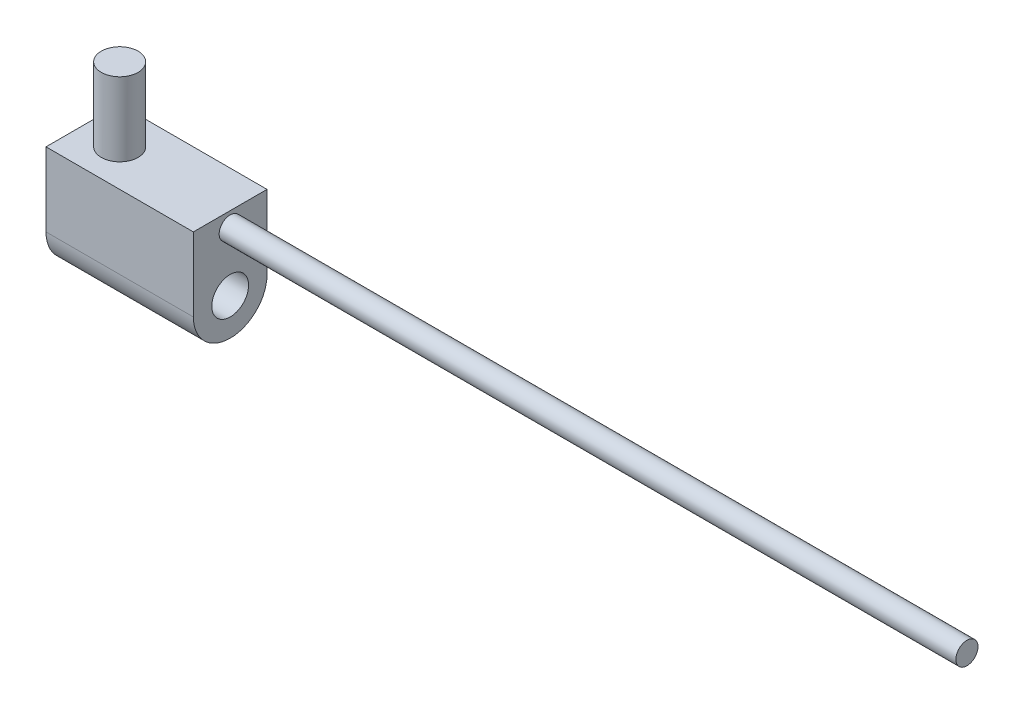
ISO-10303-21;
HEADER;
FILE_DESCRIPTION(('STEP AP214'),'2;1');
FILE_NAME('part.step','',(''),(''),'','','');
FILE_SCHEMA(('AUTOMOTIVE_DESIGN { 1 0 10303 214 1 1 1 1 }'));
ENDSEC;
DATA;
#1=APPLICATION_CONTEXT('core data for automotive mechanical design processes');
#2=APPLICATION_PROTOCOL_DEFINITION('international standard','automotive_design',2000,#1);
#3=PRODUCT_CONTEXT('',#1,'mechanical');
#4=PRODUCT('Part','Part','',(#3));
#5=PRODUCT_RELATED_PRODUCT_CATEGORY('part','',(#4));
#6=PRODUCT_DEFINITION_FORMATION('','',#4);
#7=PRODUCT_DEFINITION_CONTEXT('part definition',#1,'design');
#8=PRODUCT_DEFINITION('design','',#6,#7);
#9=PRODUCT_DEFINITION_SHAPE('','',#8);
#10=(LENGTH_UNIT() NAMED_UNIT(*) SI_UNIT(.MILLI.,.METRE.));
#11=(NAMED_UNIT(*) PLANE_ANGLE_UNIT() SI_UNIT($,.RADIAN.));
#12=(NAMED_UNIT(*) SI_UNIT($,.STERADIAN.) SOLID_ANGLE_UNIT());
#13=UNCERTAINTY_MEASURE_WITH_UNIT(LENGTH_MEASURE(1.E-05),#10,'distance_accuracy_value','');
#14=(GEOMETRIC_REPRESENTATION_CONTEXT(3) GLOBAL_UNCERTAINTY_ASSIGNED_CONTEXT((#13)) GLOBAL_UNIT_ASSIGNED_CONTEXT((#10,
#11,#12)) REPRESENTATION_CONTEXT('',''));
#15=CARTESIAN_POINT('',(0.,0.,0.));
#16=DIRECTION('',(0.,0.,1.));
#17=DIRECTION('',(1.,0.,0.));
#18=AXIS2_PLACEMENT_3D('',#15,#16,#17);
#19=CARTESIAN_POINT('',(0.,-2.5,0.));
#20=DIRECTION('',(-1.,0.,0.));
#21=DIRECTION('',(0.,0.,1.));
#22=AXIS2_PLACEMENT_3D('',#19,#20,#21);
#23=CYLINDRICAL_SURFACE('',#22,5.);
#24=DIRECTION('',(-1.,0.,0.));
#25=VECTOR('',#24,1.);
#26=CARTESIAN_POINT('',(20.,-2.5,5.));
#27=LINE('',#26,#25);
#28=CARTESIAN_POINT('',(0.,-2.5,5.));
#29=VERTEX_POINT('',#28);
#30=CARTESIAN_POINT('',(20.,-2.5,5.));
#31=VERTEX_POINT('',#30);
#32=EDGE_CURVE('E88',#29,#31,#27,.F.);
#33=ORIENTED_EDGE('',*,*,#32,.F.);
#34=CARTESIAN_POINT('',(0.,-2.5,0.));
#35=DIRECTION('',(1.,0.,0.));
#36=DIRECTION('',(0.,0.,-1.));
#37=AXIS2_PLACEMENT_3D('',#34,#35,#36);
#38=CIRCLE('',#37,5.);
#39=CARTESIAN_POINT('',(0.,-2.5,-5.));
#40=VERTEX_POINT('',#39);
#41=EDGE_CURVE('E55',#40,#29,#38,.F.);
#42=ORIENTED_EDGE('',*,*,#41,.F.);
#43=DIRECTION('',(-1.,0.,0.));
#44=VECTOR('',#43,1.);
#45=CARTESIAN_POINT('',(20.,-2.5,-5.));
#46=LINE('',#45,#44);
#47=CARTESIAN_POINT('',(20.,-2.5,-5.));
#48=VERTEX_POINT('',#47);
#49=EDGE_CURVE('E107',#48,#40,#46,.T.);
#50=ORIENTED_EDGE('',*,*,#49,.F.);
#51=CARTESIAN_POINT('',(20.,-2.5,0.));
#52=DIRECTION('',(1.,0.,0.));
#53=DIRECTION('',(0.,0.,-1.));
#54=AXIS2_PLACEMENT_3D('',#51,#52,#53);
#55=CIRCLE('',#54,5.);
#56=EDGE_CURVE('E42',#31,#48,#55,.T.);
#57=ORIENTED_EDGE('',*,*,#56,.F.);
#58=EDGE_LOOP('',(#33,#42,#50,#57));
#59=FACE_BOUND('',#58,.T.);
#60=ADVANCED_FACE('F34',(#59),#23,.T.);
#61=CARTESIAN_POINT('',(20.,-7.5,5.));
#62=DIRECTION('',(0.,0.,-1.));
#63=DIRECTION('',(-1.,0.,0.));
#64=AXIS2_PLACEMENT_3D('',#61,#62,#63);
#65=PLANE('',#64);
#66=DIRECTION('',(0.,-1.,0.));
#67=VECTOR('',#66,1.);
#68=CARTESIAN_POINT('',(0.,-7.5,5.));
#69=LINE('',#68,#67);
#70=CARTESIAN_POINT('',(0.,7.49999999999999,5.));
#71=VERTEX_POINT('',#70);
#72=EDGE_CURVE('E98',#71,#29,#69,.T.);
#73=ORIENTED_EDGE('',*,*,#72,.T.);
#74=ORIENTED_EDGE('',*,*,#32,.T.);
#75=DIRECTION('',(0.,-1.,0.));
#76=VECTOR('',#75,1.);
#77=CARTESIAN_POINT('',(20.,-7.5,5.));
#78=LINE('',#77,#76);
#79=CARTESIAN_POINT('',(20.,7.49999999999999,5.));
#80=VERTEX_POINT('',#79);
#81=EDGE_CURVE('E79',#80,#31,#78,.T.);
#82=ORIENTED_EDGE('',*,*,#81,.F.);
#83=DIRECTION('',(-1.,0.,0.));
#84=VECTOR('',#83,1.);
#85=CARTESIAN_POINT('',(20.,7.49999999999999,5.));
#86=LINE('',#85,#84);
#87=EDGE_CURVE('E89',#80,#71,#86,.T.);
#88=ORIENTED_EDGE('',*,*,#87,.T.);
#89=EDGE_LOOP('',(#73,#74,#82,#88));
#90=FACE_BOUND('',#89,.T.);
#91=ADVANCED_FACE('F113',(#90),#65,.F.);
#92=CARTESIAN_POINT('',(20.,-7.5,-5.));
#93=DIRECTION('',(0.,0.,1.));
#94=DIRECTION('',(1.,0.,0.));
#95=AXIS2_PLACEMENT_3D('',#92,#93,#94);
#96=PLANE('',#95);
#97=DIRECTION('',(0.,1.,0.));
#98=VECTOR('',#97,1.);
#99=CARTESIAN_POINT('',(20.,-7.5,-5.));
#100=LINE('',#99,#98);
#101=CARTESIAN_POINT('',(20.,7.5,-5.));
#102=VERTEX_POINT('',#101);
#103=EDGE_CURVE('E72',#48,#102,#100,.T.);
#104=ORIENTED_EDGE('',*,*,#103,.F.);
#105=ORIENTED_EDGE('',*,*,#49,.T.);
#106=DIRECTION('',(0.,1.,0.));
#107=VECTOR('',#106,1.);
#108=CARTESIAN_POINT('',(0.,-7.5,-5.));
#109=LINE('',#108,#107);
#110=CARTESIAN_POINT('',(0.,7.5,-5.));
#111=VERTEX_POINT('',#110);
#112=EDGE_CURVE('E85',#40,#111,#109,.T.);
#113=ORIENTED_EDGE('',*,*,#112,.T.);
#114=DIRECTION('',(-1.,0.,0.));
#115=VECTOR('',#114,1.);
#116=CARTESIAN_POINT('',(20.,7.5,-5.));
#117=LINE('',#116,#115);
#118=EDGE_CURVE('E82',#102,#111,#117,.T.);
#119=ORIENTED_EDGE('',*,*,#118,.F.);
#120=EDGE_LOOP('',(#104,#105,#113,#119));
#121=FACE_BOUND('',#120,.T.);
#122=ADVANCED_FACE('F83',(#121),#96,.F.);
#123=CARTESIAN_POINT('',(20.,7.5,-5.));
#124=DIRECTION('',(0.,-1.,0.));
#125=DIRECTION('',(0.,0.,-1.));
#126=AXIS2_PLACEMENT_3D('',#123,#124,#125);
#127=PLANE('',#126);
#128=CARTESIAN_POINT('',(5.,7.5,0.));
#129=DIRECTION('',(0.,-1.,0.));
#130=DIRECTION('',(0.,0.,-1.));
#131=AXIS2_PLACEMENT_3D('',#128,#129,#130);
#132=CIRCLE('',#131,2.5);
#133=CARTESIAN_POINT('',(5.,7.5,-2.5));
#134=VERTEX_POINT('',#133);
#135=EDGE_CURVE('E11',#134,#134,#132,.F.);
#136=ORIENTED_EDGE('',*,*,#135,.F.);
#137=EDGE_LOOP('',(#136));
#138=FACE_BOUND('',#137,.T.);
#139=DIRECTION('',(0.,0.,1.));
#140=VECTOR('',#139,1.);
#141=CARTESIAN_POINT('',(0.,7.5,-5.));
#142=LINE('',#141,#140);
#143=EDGE_CURVE('E103',#111,#71,#142,.T.);
#144=ORIENTED_EDGE('',*,*,#143,.T.);
#145=ORIENTED_EDGE('',*,*,#87,.F.);
#146=DIRECTION('',(0.,0.,1.));
#147=VECTOR('',#146,1.);
#148=CARTESIAN_POINT('',(20.,7.5,-5.));
#149=LINE('',#148,#147);
#150=EDGE_CURVE('E76',#102,#80,#149,.T.);
#151=ORIENTED_EDGE('',*,*,#150,.F.);
#152=ORIENTED_EDGE('',*,*,#118,.T.);
#153=EDGE_LOOP('',(#144,#145,#151,#152));
#154=FACE_BOUND('',#153,.T.);
#155=ADVANCED_FACE('F91',(#138,#154),#127,.F.);
#156=CARTESIAN_POINT('',(20.,0.,0.));
#157=DIRECTION('',(1.,0.,0.));
#158=DIRECTION('',(0.,0.,-1.));
#159=AXIS2_PLACEMENT_3D('',#156,#157,#158);
#160=PLANE('',#159);
#161=CARTESIAN_POINT('',(20.,5.5,0.));
#162=DIRECTION('',(1.,0.,0.));
#163=DIRECTION('',(0.,0.,-1.));
#164=AXIS2_PLACEMENT_3D('',#161,#162,#163);
#165=CIRCLE('',#164,1.5);
#166=CARTESIAN_POINT('',(20.,5.5,-1.5));
#167=VERTEX_POINT('',#166);
#168=EDGE_CURVE('E124',#167,#167,#165,.T.);
#169=ORIENTED_EDGE('',*,*,#168,.F.);
#170=EDGE_LOOP('',(#169));
#171=FACE_BOUND('',#170,.T.);
#172=CARTESIAN_POINT('',(20.,-2.5,0.));
#173=DIRECTION('',(1.,0.,0.));
#174=DIRECTION('',(0.,0.,-1.));
#175=AXIS2_PLACEMENT_3D('',#172,#173,#174);
#176=CIRCLE('',#175,2.5);
#177=CARTESIAN_POINT('',(20.,-2.5,-2.5));
#178=VERTEX_POINT('',#177);
#179=EDGE_CURVE('E118',#178,#178,#176,.T.);
#180=ORIENTED_EDGE('',*,*,#179,.F.);
#181=EDGE_LOOP('',(#180));
#182=FACE_BOUND('',#181,.T.);
#183=ORIENTED_EDGE('',*,*,#81,.T.);
#184=ORIENTED_EDGE('',*,*,#56,.T.);
#185=ORIENTED_EDGE('',*,*,#103,.T.);
#186=ORIENTED_EDGE('',*,*,#150,.T.);
#187=EDGE_LOOP('',(#183,#184,#185,#186));
#188=FACE_BOUND('',#187,.T.);
#189=ADVANCED_FACE('F74',(#171,#182,#188),#160,.T.);
#190=CARTESIAN_POINT('',(0.,0.,0.));
#191=DIRECTION('',(1.,0.,0.));
#192=DIRECTION('',(0.,0.,-1.));
#193=AXIS2_PLACEMENT_3D('',#190,#191,#192);
#194=PLANE('',#193);
#195=CARTESIAN_POINT('',(0.,-2.5,0.));
#196=DIRECTION('',(1.,0.,0.));
#197=DIRECTION('',(0.,0.,-1.));
#198=AXIS2_PLACEMENT_3D('',#195,#196,#197);
#199=CIRCLE('',#198,2.5);
#200=CARTESIAN_POINT('',(0.,-2.5,-2.5));
#201=VERTEX_POINT('',#200);
#202=EDGE_CURVE('E117',#201,#201,#199,.T.);
#203=ORIENTED_EDGE('',*,*,#202,.T.);
#204=EDGE_LOOP('',(#203));
#205=FACE_BOUND('',#204,.T.);
#206=ORIENTED_EDGE('',*,*,#112,.F.);
#207=ORIENTED_EDGE('',*,*,#41,.T.);
#208=ORIENTED_EDGE('',*,*,#72,.F.);
#209=ORIENTED_EDGE('',*,*,#143,.F.);
#210=EDGE_LOOP('',(#206,#207,#208,#209));
#211=FACE_BOUND('',#210,.T.);
#212=ADVANCED_FACE('F111',(#205,#211),#194,.F.);
#213=CARTESIAN_POINT('',(5.,17.5,0.));
#214=DIRECTION('',(0.,-1.,0.));
#215=DIRECTION('',(0.,0.,-1.));
#216=AXIS2_PLACEMENT_3D('',#213,#214,#215);
#217=CYLINDRICAL_SURFACE('',#216,2.5);
#218=CARTESIAN_POINT('',(5.,17.5,0.));
#219=DIRECTION('',(0.,1.,0.));
#220=DIRECTION('',(0.,0.,1.));
#221=AXIS2_PLACEMENT_3D('',#218,#219,#220);
#222=CIRCLE('',#221,2.5);
#223=CARTESIAN_POINT('',(5.,17.5,2.50000000000001));
#224=VERTEX_POINT('',#223);
#225=EDGE_CURVE('E101',#224,#224,#222,.T.);
#226=ORIENTED_EDGE('',*,*,#225,.F.);
#227=EDGE_LOOP('',(#226));
#228=FACE_BOUND('',#227,.T.);
#229=ORIENTED_EDGE('',*,*,#135,.T.);
#230=EDGE_LOOP('',(#229));
#231=FACE_BOUND('',#230,.T.);
#232=ADVANCED_FACE('F151',(#228,#231),#217,.T.);
#233=CARTESIAN_POINT('',(5.,17.5,0.));
#234=DIRECTION('',(0.,1.,0.));
#235=DIRECTION('',(0.,0.,1.));
#236=AXIS2_PLACEMENT_3D('',#233,#234,#235);
#237=PLANE('',#236);
#238=ORIENTED_EDGE('',*,*,#225,.T.);
#239=EDGE_LOOP('',(#238));
#240=FACE_BOUND('',#239,.T.);
#241=ADVANCED_FACE('F145',(#240),#237,.T.);
#242=CARTESIAN_POINT('',(0.,-2.5,0.));
#243=DIRECTION('',(1.,0.,0.));
#244=DIRECTION('',(0.,0.,-1.));
#245=AXIS2_PLACEMENT_3D('',#242,#243,#244);
#246=CYLINDRICAL_SURFACE('',#245,2.5);
#247=ORIENTED_EDGE('',*,*,#202,.F.);
#248=EDGE_LOOP('',(#247));
#249=FACE_BOUND('',#248,.T.);
#250=ORIENTED_EDGE('',*,*,#179,.T.);
#251=EDGE_LOOP('',(#250));
#252=FACE_BOUND('',#251,.T.);
#253=ADVANCED_FACE('F135',(#249,#252),#246,.F.);
#254=CARTESIAN_POINT('',(120.,5.5,0.));
#255=DIRECTION('',(-1.,0.,0.));
#256=DIRECTION('',(0.,0.,1.));
#257=AXIS2_PLACEMENT_3D('',#254,#255,#256);
#258=CYLINDRICAL_SURFACE('',#257,1.5);
#259=CARTESIAN_POINT('',(120.,5.5,0.));
#260=DIRECTION('',(1.,0.,0.));
#261=DIRECTION('',(0.,0.,-1.));
#262=AXIS2_PLACEMENT_3D('',#259,#260,#261);
#263=CIRCLE('',#262,1.5);
#264=CARTESIAN_POINT('',(120.,5.5,-1.5));
#265=VERTEX_POINT('',#264);
#266=EDGE_CURVE('E121',#265,#265,#263,.T.);
#267=ORIENTED_EDGE('',*,*,#266,.F.);
#268=EDGE_LOOP('',(#267));
#269=FACE_BOUND('',#268,.T.);
#270=ORIENTED_EDGE('',*,*,#168,.T.);
#271=EDGE_LOOP('',(#270));
#272=FACE_BOUND('',#271,.T.);
#273=ADVANCED_FACE('F132',(#269,#272),#258,.T.);
#274=CARTESIAN_POINT('',(120.,5.5,0.));
#275=DIRECTION('',(1.,0.,0.));
#276=DIRECTION('',(0.,0.,-1.));
#277=AXIS2_PLACEMENT_3D('',#274,#275,#276);
#278=PLANE('',#277);
#279=ORIENTED_EDGE('',*,*,#266,.T.);
#280=EDGE_LOOP('',(#279));
#281=FACE_BOUND('',#280,.T.);
#282=ADVANCED_FACE('F130',(#281),#278,.T.);
#283=CLOSED_SHELL('',(#60,#91,#122,#155,#189,#212,#232,#241,#253,#273,#282));
#284=MANIFOLD_SOLID_BREP('B2',#283);
#285=ADVANCED_BREP_SHAPE_REPRESENTATION('',(#18,#284),#14);
#286=SHAPE_DEFINITION_REPRESENTATION(#9,#285);
ENDSEC;
END-ISO-10303-21;
